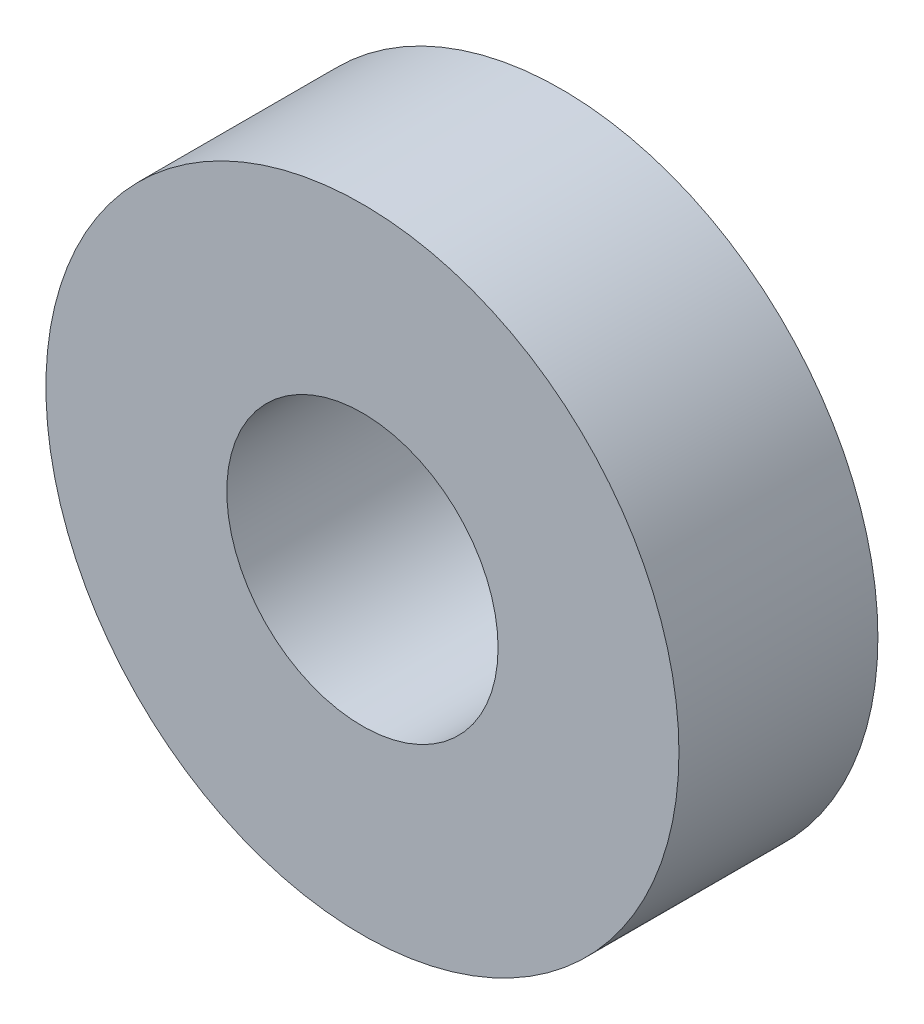
ISO-10303-21;
HEADER;
FILE_DESCRIPTION(('STEP AP214'),'2;1');
FILE_NAME('part.step','',(''),(''),'','','');
FILE_SCHEMA(('AUTOMOTIVE_DESIGN { 1 0 10303 214 1 1 1 1 }'));
ENDSEC;
DATA;
#1=APPLICATION_CONTEXT('core data for automotive mechanical design processes');
#2=APPLICATION_PROTOCOL_DEFINITION('international standard','automotive_design',2000,#1);
#3=PRODUCT_CONTEXT('',#1,'mechanical');
#4=PRODUCT('Part','Part','',(#3));
#5=PRODUCT_RELATED_PRODUCT_CATEGORY('part','',(#4));
#6=PRODUCT_DEFINITION_FORMATION('','',#4);
#7=PRODUCT_DEFINITION_CONTEXT('part definition',#1,'design');
#8=PRODUCT_DEFINITION('design','',#6,#7);
#9=PRODUCT_DEFINITION_SHAPE('','',#8);
#10=(LENGTH_UNIT() NAMED_UNIT(*) SI_UNIT(.MILLI.,.METRE.));
#11=(NAMED_UNIT(*) PLANE_ANGLE_UNIT() SI_UNIT($,.RADIAN.));
#12=(NAMED_UNIT(*) SI_UNIT($,.STERADIAN.) SOLID_ANGLE_UNIT());
#13=UNCERTAINTY_MEASURE_WITH_UNIT(LENGTH_MEASURE(1.E-05),#10,'distance_accuracy_value','');
#14=(GEOMETRIC_REPRESENTATION_CONTEXT(3) GLOBAL_UNCERTAINTY_ASSIGNED_CONTEXT((#13)) GLOBAL_UNIT_ASSIGNED_CONTEXT((#10,
#11,#12)) REPRESENTATION_CONTEXT('',''));
#15=CARTESIAN_POINT('',(0.,0.,0.));
#16=DIRECTION('',(0.,0.,1.));
#17=DIRECTION('',(1.,0.,0.));
#18=AXIS2_PLACEMENT_3D('',#15,#16,#17);
#19=CARTESIAN_POINT('',(0.,0.,11.));
#20=DIRECTION('',(0.,0.,1.));
#21=DIRECTION('',(1.,0.,0.));
#22=AXIS2_PLACEMENT_3D('',#19,#20,#21);
#23=PLANE('',#22);
#24=CARTESIAN_POINT('',(0.,0.,11.));
#25=DIRECTION('',(0.,0.,1.));
#26=DIRECTION('',(1.,0.,0.));
#27=AXIS2_PLACEMENT_3D('',#24,#25,#26);
#28=CIRCLE('',#27,17.5);
#29=CARTESIAN_POINT('',(17.5,0.,11.));
#30=VERTEX_POINT('',#29);
#31=EDGE_CURVE('E10',#30,#30,#28,.T.);
#32=ORIENTED_EDGE('',*,*,#31,.T.);
#33=EDGE_LOOP('',(#32));
#34=FACE_BOUND('',#33,.T.);
#35=CARTESIAN_POINT('',(0.,0.,11.));
#36=DIRECTION('',(0.,0.,1.));
#37=DIRECTION('',(1.,0.,0.));
#38=AXIS2_PLACEMENT_3D('',#35,#36,#37);
#39=CIRCLE('',#38,7.5);
#40=CARTESIAN_POINT('',(7.5,0.,11.));
#41=VERTEX_POINT('',#40);
#42=EDGE_CURVE('E56',#41,#41,#39,.T.);
#43=ORIENTED_EDGE('',*,*,#42,.F.);
#44=EDGE_LOOP('',(#43));
#45=FACE_BOUND('',#44,.T.);
#46=ADVANCED_FACE('F43',(#34,#45),#23,.T.);
#47=CARTESIAN_POINT('',(0.,0.,0.));
#48=DIRECTION('',(0.,0.,1.));
#49=DIRECTION('',(1.,0.,0.));
#50=AXIS2_PLACEMENT_3D('',#47,#48,#49);
#51=PLANE('',#50);
#52=CARTESIAN_POINT('',(0.,0.,0.));
#53=DIRECTION('',(0.,0.,1.));
#54=DIRECTION('',(1.,0.,0.));
#55=AXIS2_PLACEMENT_3D('',#52,#53,#54);
#56=CIRCLE('',#55,17.5);
#57=CARTESIAN_POINT('',(17.5,0.,0.));
#58=VERTEX_POINT('',#57);
#59=EDGE_CURVE('E47',#58,#58,#56,.T.);
#60=ORIENTED_EDGE('',*,*,#59,.F.);
#61=EDGE_LOOP('',(#60));
#62=FACE_BOUND('',#61,.T.);
#63=CARTESIAN_POINT('',(0.,0.,0.));
#64=DIRECTION('',(0.,0.,1.));
#65=DIRECTION('',(1.,0.,0.));
#66=AXIS2_PLACEMENT_3D('',#63,#64,#65);
#67=CIRCLE('',#66,7.5);
#68=CARTESIAN_POINT('',(7.5,0.,0.));
#69=VERTEX_POINT('',#68);
#70=EDGE_CURVE('E58',#69,#69,#67,.T.);
#71=ORIENTED_EDGE('',*,*,#70,.T.);
#72=EDGE_LOOP('',(#71));
#73=FACE_BOUND('',#72,.T.);
#74=ADVANCED_FACE('F70',(#62,#73),#51,.F.);
#75=CARTESIAN_POINT('',(0.,0.,11.));
#76=DIRECTION('',(0.,0.,-1.));
#77=DIRECTION('',(-1.,0.,0.));
#78=AXIS2_PLACEMENT_3D('',#75,#76,#77);
#79=CYLINDRICAL_SURFACE('',#78,17.5);
#80=ORIENTED_EDGE('',*,*,#31,.F.);
#81=EDGE_LOOP('',(#80));
#82=FACE_BOUND('',#81,.T.);
#83=ORIENTED_EDGE('',*,*,#59,.T.);
#84=EDGE_LOOP('',(#83));
#85=FACE_BOUND('',#84,.T.);
#86=ADVANCED_FACE('F45',(#82,#85),#79,.T.);
#87=CARTESIAN_POINT('',(0.,0.,11.));
#88=DIRECTION('',(0.,0.,-1.));
#89=DIRECTION('',(-1.,0.,0.));
#90=AXIS2_PLACEMENT_3D('',#87,#88,#89);
#91=CYLINDRICAL_SURFACE('',#90,7.5);
#92=ORIENTED_EDGE('',*,*,#42,.T.);
#93=EDGE_LOOP('',(#92));
#94=FACE_BOUND('',#93,.T.);
#95=ORIENTED_EDGE('',*,*,#70,.F.);
#96=EDGE_LOOP('',(#95));
#97=FACE_BOUND('',#96,.T.);
#98=ADVANCED_FACE('F66',(#94,#97),#91,.F.);
#99=CLOSED_SHELL('',(#46,#74,#86,#98));
#100=MANIFOLD_SOLID_BREP('B2',#99);
#101=ADVANCED_BREP_SHAPE_REPRESENTATION('',(#18,#100),#14);
#102=SHAPE_DEFINITION_REPRESENTATION(#9,#101);
ENDSEC;
END-ISO-10303-21;
